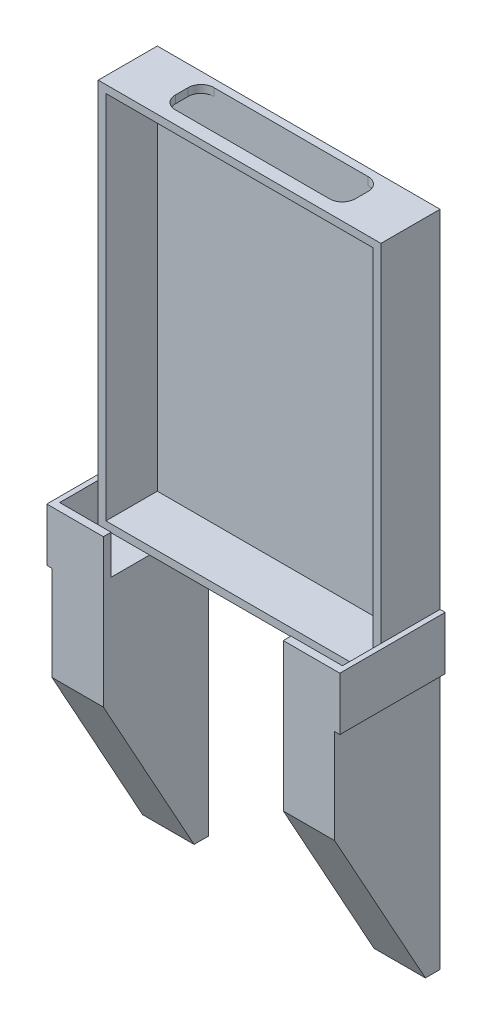
ISO-10303-21;
HEADER;
FILE_DESCRIPTION(('STEP AP214'),'2;1');
FILE_NAME('part.step','',(''),(''),'','','');
FILE_SCHEMA(('AUTOMOTIVE_DESIGN { 1 0 10303 214 1 1 1 1 }'));
ENDSEC;
DATA;
#1=APPLICATION_CONTEXT('core data for automotive mechanical design processes');
#2=APPLICATION_PROTOCOL_DEFINITION('international standard','automotive_design',2000,#1);
#3=PRODUCT_CONTEXT('',#1,'mechanical');
#4=PRODUCT('Part','Part','',(#3));
#5=PRODUCT_RELATED_PRODUCT_CATEGORY('part','',(#4));
#6=PRODUCT_DEFINITION_FORMATION('','',#4);
#7=PRODUCT_DEFINITION_CONTEXT('part definition',#1,'design');
#8=PRODUCT_DEFINITION('design','',#6,#7);
#9=PRODUCT_DEFINITION_SHAPE('','',#8);
#10=(LENGTH_UNIT() NAMED_UNIT(*) SI_UNIT(.MILLI.,.METRE.));
#11=(NAMED_UNIT(*) PLANE_ANGLE_UNIT() SI_UNIT($,.RADIAN.));
#12=(NAMED_UNIT(*) SI_UNIT($,.STERADIAN.) SOLID_ANGLE_UNIT());
#13=UNCERTAINTY_MEASURE_WITH_UNIT(LENGTH_MEASURE(1.E-05),#10,'distance_accuracy_value','');
#14=(GEOMETRIC_REPRESENTATION_CONTEXT(3) GLOBAL_UNCERTAINTY_ASSIGNED_CONTEXT((#13)) GLOBAL_UNIT_ASSIGNED_CONTEXT((#10,
#11,#12)) REPRESENTATION_CONTEXT('',''));
#15=CARTESIAN_POINT('',(0.,0.,0.));
#16=DIRECTION('',(0.,0.,1.));
#17=DIRECTION('',(1.,0.,0.));
#18=AXIS2_PLACEMENT_3D('',#15,#16,#17);
#19=CARTESIAN_POINT('',(-55.,-75.,3.));
#20=DIRECTION('',(0.,1.,0.));
#21=DIRECTION('',(0.,0.,1.));
#22=AXIS2_PLACEMENT_3D('',#19,#20,#21);
#23=PLANE('',#22);
#24=DIRECTION('',(0.,0.,-1.));
#25=VECTOR('',#24,1.);
#26=CARTESIAN_POINT('',(35.,-75.,0.));
#27=LINE('',#26,#25);
#28=CARTESIAN_POINT('',(35.,-75.,23.));
#29=VERTEX_POINT('',#28);
#30=CARTESIAN_POINT('',(35.,-75.,0.));
#31=VERTEX_POINT('',#30);
#32=EDGE_CURVE('E60',#29,#31,#27,.T.);
#33=ORIENTED_EDGE('',*,*,#32,.F.);
#34=DIRECTION('',(1.,0.,0.));
#35=VECTOR('',#34,1.);
#36=CARTESIAN_POINT('',(-55.,-75.,23.));
#37=LINE('',#36,#35);
#38=CARTESIAN_POINT('',(-35.,-75.,23.));
#39=VERTEX_POINT('',#38);
#40=EDGE_CURVE('E453',#39,#29,#37,.T.);
#41=ORIENTED_EDGE('',*,*,#40,.F.);
#42=DIRECTION('',(0.,0.,-1.));
#43=VECTOR('',#42,1.);
#44=CARTESIAN_POINT('',(-35.,-75.,0.));
#45=LINE('',#44,#43);
#46=CARTESIAN_POINT('',(-35.,-75.,0.));
#47=VERTEX_POINT('',#46);
#48=EDGE_CURVE('E378',#39,#47,#45,.T.);
#49=ORIENTED_EDGE('',*,*,#48,.T.);
#50=DIRECTION('',(1.,0.,0.));
#51=VECTOR('',#50,1.);
#52=CARTESIAN_POINT('',(-55.,-75.,0.));
#53=LINE('',#52,#51);
#54=EDGE_CURVE('E56',#47,#31,#53,.T.);
#55=ORIENTED_EDGE('',*,*,#54,.T.);
#56=EDGE_LOOP('',(#33,#41,#49,#55));
#57=FACE_BOUND('',#56,.T.);
#58=ADVANCED_FACE('F39',(#57),#23,.F.);
#59=CARTESIAN_POINT('',(55.,0.,0.));
#60=DIRECTION('',(-1.,0.,0.));
#61=DIRECTION('',(0.,0.,-1.));
#62=AXIS2_PLACEMENT_3D('',#59,#60,#61);
#63=PLANE('',#62);
#64=DIRECTION('',(0.,0.,-1.));
#65=VECTOR('',#64,1.);
#66=CARTESIAN_POINT('',(55.,-75.,23.));
#67=LINE('',#66,#65);
#68=CARTESIAN_POINT('',(55.,-75.,38.));
#69=VERTEX_POINT('',#68);
#70=CARTESIAN_POINT('',(55.,-75.,23.));
#71=VERTEX_POINT('',#70);
#72=EDGE_CURVE('E1122',#69,#71,#67,.T.);
#73=ORIENTED_EDGE('',*,*,#72,.F.);
#74=DIRECTION('',(0.,-1.,0.));
#75=VECTOR('',#74,1.);
#76=CARTESIAN_POINT('',(55.,-75.,38.));
#77=LINE('',#76,#75);
#78=CARTESIAN_POINT('',(55.,-59.8162092115961,38.));
#79=VERTEX_POINT('',#78);
#80=EDGE_CURVE('E296',#79,#69,#77,.T.);
#81=ORIENTED_EDGE('',*,*,#80,.F.);
#82=DIRECTION('',(0.,0.,-1.));
#83=VECTOR('',#82,1.);
#84=CARTESIAN_POINT('',(55.,-59.8162092115961,41.));
#85=LINE('',#84,#83);
#86=CARTESIAN_POINT('',(55.,-59.8162092115961,23.));
#87=VERTEX_POINT('',#86);
#88=EDGE_CURVE('E49',#79,#87,#85,.T.);
#89=ORIENTED_EDGE('',*,*,#88,.T.);
#90=DIRECTION('',(0.,1.,0.));
#91=VECTOR('',#90,1.);
#92=CARTESIAN_POINT('',(55.,-75.,23.));
#93=LINE('',#92,#91);
#94=EDGE_CURVE('E458',#71,#87,#93,.T.);
#95=ORIENTED_EDGE('',*,*,#94,.F.);
#96=EDGE_LOOP('',(#73,#81,#89,#95));
#97=FACE_BOUND('',#96,.T.);
#98=ADVANCED_FACE('F572',(#97),#63,.T.);
#99=CARTESIAN_POINT('',(-55.,-75.,3.));
#100=DIRECTION('',(1.,0.,0.));
#101=DIRECTION('',(0.,0.,-1.));
#102=AXIS2_PLACEMENT_3D('',#99,#100,#101);
#103=PLANE('',#102);
#104=DIRECTION('',(0.,0.,1.));
#105=VECTOR('',#104,1.);
#106=CARTESIAN_POINT('',(-55.,-80.5021010947171,41.));
#107=LINE('',#106,#105);
#108=CARTESIAN_POINT('',(-55.,-80.5021010947171,0.));
#109=VERTEX_POINT('',#108);
#110=CARTESIAN_POINT('',(-55.,-80.5021010947171,41.));
#111=VERTEX_POINT('',#110);
#112=EDGE_CURVE('E354',#109,#111,#107,.T.);
#113=ORIENTED_EDGE('',*,*,#112,.F.);
#114=DIRECTION('',(0.,-1.,0.));
#115=VECTOR('',#114,1.);
#116=CARTESIAN_POINT('',(-55.,-75.,0.));
#117=LINE('',#116,#115);
#118=CARTESIAN_POINT('',(-55.,-181.163787755552,0.));
#119=VERTEX_POINT('',#118);
#120=EDGE_CURVE('E473',#109,#119,#117,.T.);
#121=ORIENTED_EDGE('',*,*,#120,.T.);
#122=DIRECTION('',(0.,0.,1.));
#123=VECTOR('',#122,1.);
#124=CARTESIAN_POINT('',(-55.,-181.163787755552,5.7001744563118));
#125=LINE('',#124,#123);
#126=CARTESIAN_POINT('',(-55.,-181.163787755552,5.7001744563118));
#127=VERTEX_POINT('',#126);
#128=EDGE_CURVE('E374',#119,#127,#125,.T.);
#129=ORIENTED_EDGE('',*,*,#128,.T.);
#130=DIRECTION('',(0.,0.875411091895848,0.483379168133794));
#131=VECTOR('',#130,1.);
#132=CARTESIAN_POINT('',(-55.,-117.234969841786,41.));
#133=LINE('',#132,#131);
#134=CARTESIAN_POINT('',(-55.,-117.234969841786,41.));
#135=VERTEX_POINT('',#134);
#136=EDGE_CURVE('E399',#127,#135,#133,.T.);
#137=ORIENTED_EDGE('',*,*,#136,.T.);
#138=DIRECTION('',(0.,1.,0.));
#139=VECTOR('',#138,1.);
#140=CARTESIAN_POINT('',(-55.,-59.8162092115961,41.));
#141=LINE('',#140,#139);
#142=EDGE_CURVE('E402',#135,#111,#141,.T.);
#143=ORIENTED_EDGE('',*,*,#142,.T.);
#144=EDGE_LOOP('',(#113,#121,#129,#137,#143));
#145=FACE_BOUND('',#144,.T.);
#146=ADVANCED_FACE('F579',(#145),#103,.F.);
#147=CARTESIAN_POINT('',(-55.,75.,0.));
#148=VERTEX_POINT('',#147);
#149=CARTESIAN_POINT('',(-55.,-59.8162092115961,0.));
#150=VERTEX_POINT('',#149);
#151=EDGE_CURVE('E474',#148,#150,#117,.T.);
#152=ORIENTED_EDGE('',*,*,#151,.T.);
#153=DIRECTION('',(0.,0.,-1.));
#154=VECTOR('',#153,1.);
#155=CARTESIAN_POINT('',(-55.,-59.8162092115961,41.));
#156=LINE('',#155,#154);
#157=CARTESIAN_POINT('',(-55.,-59.8162092115961,23.));
#158=VERTEX_POINT('',#157);
#159=EDGE_CURVE('E363',#158,#150,#156,.T.);
#160=ORIENTED_EDGE('',*,*,#159,.F.);
#161=DIRECTION('',(0.,-1.,0.));
#162=VECTOR('',#161,1.);
#163=CARTESIAN_POINT('',(-55.,75.,23.));
#164=LINE('',#163,#162);
#165=CARTESIAN_POINT('',(-55.,75.,23.));
#166=VERTEX_POINT('',#165);
#167=EDGE_CURVE('E465',#166,#158,#164,.T.);
#168=ORIENTED_EDGE('',*,*,#167,.F.);
#169=DIRECTION('',(0.,0.,-1.));
#170=VECTOR('',#169,1.);
#171=CARTESIAN_POINT('',(-55.,75.,3.));
#172=LINE('',#171,#170);
#173=EDGE_CURVE('E478',#166,#148,#172,.T.);
#174=ORIENTED_EDGE('',*,*,#173,.T.);
#175=EDGE_LOOP('',(#152,#160,#168,#174));
#176=FACE_BOUND('',#175,.T.);
#177=ADVANCED_FACE('F588',(#176),#103,.F.);
#178=CARTESIAN_POINT('',(55.,-75.,3.));
#179=DIRECTION('',(-1.,0.,0.));
#180=DIRECTION('',(0.,0.,1.));
#181=AXIS2_PLACEMENT_3D('',#178,#179,#180);
#182=PLANE('',#181);
#183=CARTESIAN_POINT('',(55.,75.,23.));
#184=VERTEX_POINT('',#183);
#185=EDGE_CURVE('E457',#87,#184,#93,.T.);
#186=ORIENTED_EDGE('',*,*,#185,.F.);
#187=CARTESIAN_POINT('',(55.,-59.8162092115961,0.));
#188=VERTEX_POINT('',#187);
#189=EDGE_CURVE('E11',#87,#188,#85,.T.);
#190=ORIENTED_EDGE('',*,*,#189,.T.);
#191=DIRECTION('',(0.,1.,0.));
#192=VECTOR('',#191,1.);
#193=CARTESIAN_POINT('',(55.,-75.,0.));
#194=LINE('',#193,#192);
#195=CARTESIAN_POINT('',(55.,75.,0.));
#196=VERTEX_POINT('',#195);
#197=EDGE_CURVE('E468',#188,#196,#194,.T.);
#198=ORIENTED_EDGE('',*,*,#197,.T.);
#199=DIRECTION('',(0.,0.,-1.));
#200=VECTOR('',#199,1.);
#201=CARTESIAN_POINT('',(55.,75.,3.));
#202=LINE('',#201,#200);
#203=EDGE_CURVE('E480',#184,#196,#202,.T.);
#204=ORIENTED_EDGE('',*,*,#203,.F.);
#205=EDGE_LOOP('',(#186,#190,#198,#204));
#206=FACE_BOUND('',#205,.T.);
#207=ADVANCED_FACE('F592',(#206),#182,.F.);
#208=CARTESIAN_POINT('',(-55.,75.,3.));
#209=DIRECTION('',(0.,-1.,0.));
#210=DIRECTION('',(0.,0.,-1.));
#211=AXIS2_PLACEMENT_3D('',#208,#209,#210);
#212=PLANE('',#211);
#213=CARTESIAN_POINT('',(-30.,75.,8.));
#214=DIRECTION('',(0.,-1.,0.));
#215=DIRECTION('',(0.,0.,-1.));
#216=AXIS2_PLACEMENT_3D('',#213,#214,#215);
#217=CIRCLE('',#216,5.);
#218=CARTESIAN_POINT('',(-35.,75.,8.));
#219=VERTEX_POINT('',#218);
#220=CARTESIAN_POINT('',(-30.,75.,3.));
#221=VERTEX_POINT('',#220);
#222=EDGE_CURVE('E511',#219,#221,#217,.T.);
#223=ORIENTED_EDGE('',*,*,#222,.T.);
#224=DIRECTION('',(-1.,0.,0.));
#225=VECTOR('',#224,1.);
#226=CARTESIAN_POINT('',(-35.,75.,3.));
#227=LINE('',#226,#225);
#228=CARTESIAN_POINT('',(30.,75.,3.));
#229=VERTEX_POINT('',#228);
#230=EDGE_CURVE('E340',#229,#221,#227,.T.);
#231=ORIENTED_EDGE('',*,*,#230,.F.);
#232=CARTESIAN_POINT('',(30.,75.,8.));
#233=DIRECTION('',(0.,-1.,0.));
#234=DIRECTION('',(0.,0.,-1.));
#235=AXIS2_PLACEMENT_3D('',#232,#233,#234);
#236=CIRCLE('',#235,5.);
#237=CARTESIAN_POINT('',(35.,75.,8.));
#238=VERTEX_POINT('',#237);
#239=EDGE_CURVE('E518',#229,#238,#236,.T.);
#240=ORIENTED_EDGE('',*,*,#239,.T.);
#241=DIRECTION('',(0.,0.,-1.));
#242=VECTOR('',#241,1.);
#243=CARTESIAN_POINT('',(35.,75.,3.));
#244=LINE('',#243,#242);
#245=CARTESIAN_POINT('',(35.,75.,13.));
#246=VERTEX_POINT('',#245);
#247=EDGE_CURVE('E337',#246,#238,#244,.T.);
#248=ORIENTED_EDGE('',*,*,#247,.F.);
#249=CARTESIAN_POINT('',(30.,75.,13.));
#250=DIRECTION('',(0.,-1.,0.));
#251=DIRECTION('',(0.,0.,-1.));
#252=AXIS2_PLACEMENT_3D('',#249,#250,#251);
#253=CIRCLE('',#252,5.);
#254=CARTESIAN_POINT('',(30.,75.,18.));
#255=VERTEX_POINT('',#254);
#256=EDGE_CURVE('E515',#246,#255,#253,.T.);
#257=ORIENTED_EDGE('',*,*,#256,.T.);
#258=DIRECTION('',(1.,0.,0.));
#259=VECTOR('',#258,1.);
#260=CARTESIAN_POINT('',(-35.,75.,18.));
#261=LINE('',#260,#259);
#262=CARTESIAN_POINT('',(-30.,75.,18.));
#263=VERTEX_POINT('',#262);
#264=EDGE_CURVE('E334',#263,#255,#261,.T.);
#265=ORIENTED_EDGE('',*,*,#264,.F.);
#266=CARTESIAN_POINT('',(-30.,75.,13.));
#267=DIRECTION('',(0.,-1.,0.));
#268=DIRECTION('',(0.,0.,-1.));
#269=AXIS2_PLACEMENT_3D('',#266,#267,#268);
#270=CIRCLE('',#269,5.);
#271=CARTESIAN_POINT('',(-35.,75.,13.));
#272=VERTEX_POINT('',#271);
#273=EDGE_CURVE('E507',#263,#272,#270,.T.);
#274=ORIENTED_EDGE('',*,*,#273,.T.);
#275=DIRECTION('',(0.,0.,1.));
#276=VECTOR('',#275,1.);
#277=CARTESIAN_POINT('',(-35.,75.,3.));
#278=LINE('',#277,#276);
#279=EDGE_CURVE('E331',#219,#272,#278,.T.);
#280=ORIENTED_EDGE('',*,*,#279,.F.);
#281=EDGE_LOOP('',(#223,#231,#240,#248,#257,#265,#274,#280));
#282=FACE_BOUND('',#281,.T.);
#283=DIRECTION('',(-1.,0.,0.));
#284=VECTOR('',#283,1.);
#285=CARTESIAN_POINT('',(-55.,75.,0.));
#286=LINE('',#285,#284);
#287=EDGE_CURVE('E470',#196,#148,#286,.T.);
#288=ORIENTED_EDGE('',*,*,#287,.T.);
#289=ORIENTED_EDGE('',*,*,#173,.F.);
#290=DIRECTION('',(-1.,0.,0.));
#291=VECTOR('',#290,1.);
#292=CARTESIAN_POINT('',(55.,75.,23.));
#293=LINE('',#292,#291);
#294=EDGE_CURVE('E461',#184,#166,#293,.T.);
#295=ORIENTED_EDGE('',*,*,#294,.F.);
#296=ORIENTED_EDGE('',*,*,#203,.T.);
#297=EDGE_LOOP('',(#288,#289,#295,#296));
#298=FACE_BOUND('',#297,.T.);
#299=ADVANCED_FACE('F536',(#282,#298),#212,.F.);
#300=CARTESIAN_POINT('',(0.,0.,0.));
#301=DIRECTION('',(0.,0.,-1.));
#302=DIRECTION('',(-1.,0.,0.));
#303=AXIS2_PLACEMENT_3D('',#300,#301,#302);
#304=PLANE('',#303);
#305=DIRECTION('',(1.,0.,0.));
#306=VECTOR('',#305,1.);
#307=CARTESIAN_POINT('',(-57.,-59.8162092115961,0.));
#308=LINE('',#307,#306);
#309=CARTESIAN_POINT('',(-57.,-59.8162092115961,0.));
#310=VERTEX_POINT('',#309);
#311=EDGE_CURVE('E371',#310,#150,#308,.T.);
#312=ORIENTED_EDGE('',*,*,#311,.T.);
#313=ORIENTED_EDGE('',*,*,#151,.F.);
#314=ORIENTED_EDGE('',*,*,#287,.F.);
#315=ORIENTED_EDGE('',*,*,#197,.F.);
#316=DIRECTION('',(-1.,0.,0.));
#317=VECTOR('',#316,1.);
#318=CARTESIAN_POINT('',(57.,-59.8162092115961,0.));
#319=LINE('',#318,#317);
#320=CARTESIAN_POINT('',(57.,-59.8162092115961,0.));
#321=VERTEX_POINT('',#320);
#322=EDGE_CURVE('E325',#321,#188,#319,.T.);
#323=ORIENTED_EDGE('',*,*,#322,.F.);
#324=DIRECTION('',(0.,-1.,0.));
#325=VECTOR('',#324,1.);
#326=CARTESIAN_POINT('',(57.,-59.8162092115961,0.));
#327=LINE('',#326,#325);
#328=CARTESIAN_POINT('',(57.,-80.5021010947171,0.));
#329=VERTEX_POINT('',#328);
#330=EDGE_CURVE('E315',#321,#329,#327,.T.);
#331=ORIENTED_EDGE('',*,*,#330,.T.);
#332=DIRECTION('',(-1.,0.,0.));
#333=VECTOR('',#332,1.);
#334=CARTESIAN_POINT('',(57.,-80.5021010947171,0.));
#335=LINE('',#334,#333);
#336=CARTESIAN_POINT('',(55.,-80.5021010947171,0.));
#337=VERTEX_POINT('',#336);
#338=EDGE_CURVE('E327',#329,#337,#335,.T.);
#339=ORIENTED_EDGE('',*,*,#338,.T.);
#340=DIRECTION('',(0.,-1.,0.));
#341=VECTOR('',#340,1.);
#342=CARTESIAN_POINT('',(55.,-181.163787755552,0.));
#343=LINE('',#342,#341);
#344=CARTESIAN_POINT('',(55.,-181.163787755552,0.));
#345=VERTEX_POINT('',#344);
#346=EDGE_CURVE('E1098',#337,#345,#343,.T.);
#347=ORIENTED_EDGE('',*,*,#346,.T.);
#348=DIRECTION('',(1.,0.,0.));
#349=VECTOR('',#348,1.);
#350=CARTESIAN_POINT('',(35.,-181.163787755552,0.));
#351=LINE('',#350,#349);
#352=CARTESIAN_POINT('',(35.,-181.163787755552,0.));
#353=VERTEX_POINT('',#352);
#354=EDGE_CURVE('E308',#353,#345,#351,.T.);
#355=ORIENTED_EDGE('',*,*,#354,.F.);
#356=DIRECTION('',(0.,-1.,0.));
#357=VECTOR('',#356,1.);
#358=CARTESIAN_POINT('',(35.,-181.163787755552,0.));
#359=LINE('',#358,#357);
#360=EDGE_CURVE('E298',#31,#353,#359,.T.);
#361=ORIENTED_EDGE('',*,*,#360,.F.);
#362=ORIENTED_EDGE('',*,*,#54,.F.);
#363=DIRECTION('',(0.,-1.,0.));
#364=VECTOR('',#363,1.);
#365=CARTESIAN_POINT('',(-35.,-181.163787755552,0.));
#366=LINE('',#365,#364);
#367=CARTESIAN_POINT('',(-35.,-181.163787755552,0.));
#368=VERTEX_POINT('',#367);
#369=EDGE_CURVE('E377',#47,#368,#366,.T.);
#370=ORIENTED_EDGE('',*,*,#369,.T.);
#371=DIRECTION('',(-1.,0.,0.));
#372=VECTOR('',#371,1.);
#373=CARTESIAN_POINT('',(-35.,-181.163787755552,0.));
#374=LINE('',#373,#372);
#375=EDGE_CURVE('E396',#368,#119,#374,.T.);
#376=ORIENTED_EDGE('',*,*,#375,.T.);
#377=ORIENTED_EDGE('',*,*,#120,.F.);
#378=DIRECTION('',(1.,0.,0.));
#379=VECTOR('',#378,1.);
#380=CARTESIAN_POINT('',(-57.,-80.5021010947171,0.));
#381=LINE('',#380,#379);
#382=CARTESIAN_POINT('',(-57.,-80.5021010947171,0.));
#383=VERTEX_POINT('',#382);
#384=EDGE_CURVE('E368',#383,#109,#381,.T.);
#385=ORIENTED_EDGE('',*,*,#384,.F.);
#386=DIRECTION('',(0.,-1.,0.));
#387=VECTOR('',#386,1.);
#388=CARTESIAN_POINT('',(-57.,-59.8162092115961,0.));
#389=LINE('',#388,#387);
#390=EDGE_CURVE('E356',#310,#383,#389,.T.);
#391=ORIENTED_EDGE('',*,*,#390,.F.);
#392=EDGE_LOOP('',(#312,#313,#314,#315,#323,#331,#339,#347,#355,#361,#362,#370,#376,#377,#385,#391));
#393=FACE_BOUND('',#392,.T.);
#394=ADVANCED_FACE('F584',(#393),#304,.T.);
#395=CARTESIAN_POINT('',(0.,0.,23.));
#396=DIRECTION('',(0.,0.,1.));
#397=DIRECTION('',(1.,0.,0.));
#398=AXIS2_PLACEMENT_3D('',#395,#396,#397);
#399=PLANE('',#398);
#400=CARTESIAN_POINT('',(-55.,-75.,23.));
#401=VERTEX_POINT('',#400);
#402=EDGE_CURVE('E454',#401,#39,#37,.T.);
#403=ORIENTED_EDGE('',*,*,#402,.T.);
#404=ORIENTED_EDGE('',*,*,#40,.T.);
#405=DIRECTION('',(1.,0.,0.));
#406=VECTOR('',#405,1.);
#407=CARTESIAN_POINT('',(0.,-75.,23.));
#408=LINE('',#407,#406);
#409=EDGE_CURVE('E280',#29,#71,#408,.T.);
#410=ORIENTED_EDGE('',*,*,#409,.T.);
#411=ORIENTED_EDGE('',*,*,#94,.T.);
#412=ORIENTED_EDGE('',*,*,#185,.T.);
#413=ORIENTED_EDGE('',*,*,#294,.T.);
#414=ORIENTED_EDGE('',*,*,#167,.T.);
#415=EDGE_CURVE('E464',#158,#401,#164,.T.);
#416=ORIENTED_EDGE('',*,*,#415,.T.);
#417=EDGE_LOOP('',(#403,#404,#410,#411,#412,#413,#414,#416));
#418=FACE_BOUND('',#417,.T.);
#419=DIRECTION('',(0.,1.,0.));
#420=VECTOR('',#419,1.);
#421=CARTESIAN_POINT('',(52.,-72.,23.));
#422=LINE('',#421,#420);
#423=CARTESIAN_POINT('',(52.,-72.,23.));
#424=VERTEX_POINT('',#423);
#425=CARTESIAN_POINT('',(52.,72.,23.));
#426=VERTEX_POINT('',#425);
#427=EDGE_CURVE('E425',#424,#426,#422,.T.);
#428=ORIENTED_EDGE('',*,*,#427,.F.);
#429=DIRECTION('',(1.,0.,0.));
#430=VECTOR('',#429,1.);
#431=CARTESIAN_POINT('',(-52.,-72.,23.));
#432=LINE('',#431,#430);
#433=CARTESIAN_POINT('',(-52.,-72.,23.));
#434=VERTEX_POINT('',#433);
#435=EDGE_CURVE('E423',#434,#424,#432,.T.);
#436=ORIENTED_EDGE('',*,*,#435,.F.);
#437=DIRECTION('',(0.,-1.,0.));
#438=VECTOR('',#437,1.);
#439=CARTESIAN_POINT('',(-52.,72.,23.));
#440=LINE('',#439,#438);
#441=CARTESIAN_POINT('',(-52.,72.,23.));
#442=VERTEX_POINT('',#441);
#443=EDGE_CURVE('E431',#442,#434,#440,.T.);
#444=ORIENTED_EDGE('',*,*,#443,.F.);
#445=DIRECTION('',(-1.,0.,0.));
#446=VECTOR('',#445,1.);
#447=CARTESIAN_POINT('',(52.,72.,23.));
#448=LINE('',#447,#446);
#449=EDGE_CURVE('E428',#426,#442,#448,.T.);
#450=ORIENTED_EDGE('',*,*,#449,.F.);
#451=EDGE_LOOP('',(#428,#436,#444,#450));
#452=FACE_BOUND('',#451,.T.);
#453=ADVANCED_FACE('F708',(#418,#452),#399,.T.);
#454=CARTESIAN_POINT('',(-52.,-72.,23.));
#455=DIRECTION('',(0.,1.,0.));
#456=DIRECTION('',(0.,0.,1.));
#457=AXIS2_PLACEMENT_3D('',#454,#455,#456);
#458=PLANE('',#457);
#459=DIRECTION('',(1.,0.,0.));
#460=VECTOR('',#459,1.);
#461=CARTESIAN_POINT('',(-52.,-72.,3.));
#462=LINE('',#461,#460);
#463=CARTESIAN_POINT('',(-52.,-72.,3.));
#464=VERTEX_POINT('',#463);
#465=CARTESIAN_POINT('',(52.,-72.,3.));
#466=VERTEX_POINT('',#465);
#467=EDGE_CURVE('E412',#464,#466,#462,.T.);
#468=ORIENTED_EDGE('',*,*,#467,.F.);
#469=DIRECTION('',(0.,0.,-1.));
#470=VECTOR('',#469,1.);
#471=CARTESIAN_POINT('',(-52.,-72.,23.));
#472=LINE('',#471,#470);
#473=EDGE_CURVE('E433',#434,#464,#472,.T.);
#474=ORIENTED_EDGE('',*,*,#473,.F.);
#475=ORIENTED_EDGE('',*,*,#435,.T.);
#476=DIRECTION('',(0.,0.,-1.));
#477=VECTOR('',#476,1.);
#478=CARTESIAN_POINT('',(52.,-72.,23.));
#479=LINE('',#478,#477);
#480=EDGE_CURVE('E450',#424,#466,#479,.T.);
#481=ORIENTED_EDGE('',*,*,#480,.T.);
#482=EDGE_LOOP('',(#468,#474,#475,#481));
#483=FACE_BOUND('',#482,.T.);
#484=ADVANCED_FACE('F712',(#483),#458,.T.);
#485=CARTESIAN_POINT('',(52.,-72.,23.));
#486=DIRECTION('',(-1.,0.,0.));
#487=DIRECTION('',(0.,0.,1.));
#488=AXIS2_PLACEMENT_3D('',#485,#486,#487);
#489=PLANE('',#488);
#490=DIRECTION('',(0.,1.,0.));
#491=VECTOR('',#490,1.);
#492=CARTESIAN_POINT('',(52.,-72.,3.));
#493=LINE('',#492,#491);
#494=CARTESIAN_POINT('',(52.,72.,3.));
#495=VERTEX_POINT('',#494);
#496=EDGE_CURVE('E436',#466,#495,#493,.T.);
#497=ORIENTED_EDGE('',*,*,#496,.F.);
#498=ORIENTED_EDGE('',*,*,#480,.F.);
#499=ORIENTED_EDGE('',*,*,#427,.T.);
#500=DIRECTION('',(0.,0.,-1.));
#501=VECTOR('',#500,1.);
#502=CARTESIAN_POINT('',(52.,72.,23.));
#503=LINE('',#502,#501);
#504=EDGE_CURVE('E448',#426,#495,#503,.T.);
#505=ORIENTED_EDGE('',*,*,#504,.T.);
#506=EDGE_LOOP('',(#497,#498,#499,#505));
#507=FACE_BOUND('',#506,.T.);
#508=ADVANCED_FACE('F982',(#507),#489,.T.);
#509=CARTESIAN_POINT('',(52.,72.,23.));
#510=DIRECTION('',(0.,-1.,0.));
#511=DIRECTION('',(0.,0.,-1.));
#512=AXIS2_PLACEMENT_3D('',#509,#510,#511);
#513=PLANE('',#512);
#514=DIRECTION('',(0.,0.,-1.));
#515=VECTOR('',#514,1.);
#516=CARTESIAN_POINT('',(-35.,72.,23.));
#517=LINE('',#516,#515);
#518=CARTESIAN_POINT('',(-35.,72.,13.));
#519=VERTEX_POINT('',#518);
#520=CARTESIAN_POINT('',(-35.,72.,8.));
#521=VERTEX_POINT('',#520);
#522=EDGE_CURVE('E346',#519,#521,#517,.T.);
#523=ORIENTED_EDGE('',*,*,#522,.F.);
#524=CARTESIAN_POINT('',(-30.,72.,13.));
#525=DIRECTION('',(0.,-1.,0.));
#526=DIRECTION('',(0.,0.,-1.));
#527=AXIS2_PLACEMENT_3D('',#524,#525,#526);
#528=CIRCLE('',#527,5.);
#529=CARTESIAN_POINT('',(-30.,72.,18.));
#530=VERTEX_POINT('',#529);
#531=EDGE_CURVE('E509',#519,#530,#528,.F.);
#532=ORIENTED_EDGE('',*,*,#531,.T.);
#533=DIRECTION('',(-1.,0.,0.));
#534=VECTOR('',#533,1.);
#535=CARTESIAN_POINT('',(52.,72.,18.));
#536=LINE('',#535,#534);
#537=CARTESIAN_POINT('',(30.,72.,18.));
#538=VERTEX_POINT('',#537);
#539=EDGE_CURVE('E483',#538,#530,#536,.T.);
#540=ORIENTED_EDGE('',*,*,#539,.F.);
#541=CARTESIAN_POINT('',(30.,72.,13.));
#542=DIRECTION('',(0.,-1.,0.));
#543=DIRECTION('',(0.,0.,-1.));
#544=AXIS2_PLACEMENT_3D('',#541,#542,#543);
#545=CIRCLE('',#544,5.);
#546=CARTESIAN_POINT('',(35.,72.,13.));
#547=VERTEX_POINT('',#546);
#548=EDGE_CURVE('E517',#538,#547,#545,.F.);
#549=ORIENTED_EDGE('',*,*,#548,.T.);
#550=DIRECTION('',(0.,0.,1.));
#551=VECTOR('',#550,1.);
#552=CARTESIAN_POINT('',(35.,72.,23.));
#553=LINE('',#552,#551);
#554=CARTESIAN_POINT('',(35.,72.,8.));
#555=VERTEX_POINT('',#554);
#556=EDGE_CURVE('E343',#555,#547,#553,.T.);
#557=ORIENTED_EDGE('',*,*,#556,.F.);
#558=CARTESIAN_POINT('',(30.,72.,8.));
#559=DIRECTION('',(0.,-1.,0.));
#560=DIRECTION('',(0.,0.,-1.));
#561=AXIS2_PLACEMENT_3D('',#558,#559,#560);
#562=CIRCLE('',#561,5.);
#563=CARTESIAN_POINT('',(30.,72.,3.));
#564=VERTEX_POINT('',#563);
#565=EDGE_CURVE('E43',#555,#564,#562,.F.);
#566=ORIENTED_EDGE('',*,*,#565,.T.);
#567=DIRECTION('',(-1.,0.,0.));
#568=VECTOR('',#567,1.);
#569=CARTESIAN_POINT('',(52.,72.,3.));
#570=LINE('',#569,#568);
#571=EDGE_CURVE('E440',#495,#564,#570,.T.);
#572=ORIENTED_EDGE('',*,*,#571,.F.);
#573=ORIENTED_EDGE('',*,*,#504,.F.);
#574=ORIENTED_EDGE('',*,*,#449,.T.);
#575=DIRECTION('',(0.,0.,-1.));
#576=VECTOR('',#575,1.);
#577=CARTESIAN_POINT('',(-52.,72.,23.));
#578=LINE('',#577,#576);
#579=CARTESIAN_POINT('',(-52.,72.,3.));
#580=VERTEX_POINT('',#579);
#581=EDGE_CURVE('E445',#442,#580,#578,.T.);
#582=ORIENTED_EDGE('',*,*,#581,.T.);
#583=CARTESIAN_POINT('',(-30.,72.,3.));
#584=VERTEX_POINT('',#583);
#585=EDGE_CURVE('E439',#584,#580,#570,.T.);
#586=ORIENTED_EDGE('',*,*,#585,.F.);
#587=CARTESIAN_POINT('',(-30.,72.,8.));
#588=DIRECTION('',(0.,-1.,0.));
#589=DIRECTION('',(0.,0.,-1.));
#590=AXIS2_PLACEMENT_3D('',#587,#588,#589);
#591=CIRCLE('',#590,5.);
#592=EDGE_CURVE('E513',#584,#521,#591,.F.);
#593=ORIENTED_EDGE('',*,*,#592,.T.);
#594=EDGE_LOOP('',(#523,#532,#540,#549,#557,#566,#572,#573,#574,#582,#586,#593));
#595=FACE_BOUND('',#594,.T.);
#596=ADVANCED_FACE('F529',(#595),#513,.T.);
#597=CARTESIAN_POINT('',(-52.,72.,23.));
#598=DIRECTION('',(1.,0.,0.));
#599=DIRECTION('',(0.,0.,-1.));
#600=AXIS2_PLACEMENT_3D('',#597,#598,#599);
#601=PLANE('',#600);
#602=DIRECTION('',(0.,-1.,0.));
#603=VECTOR('',#602,1.);
#604=CARTESIAN_POINT('',(-52.,72.,3.));
#605=LINE('',#604,#603);
#606=EDGE_CURVE('E426',#580,#464,#605,.T.);
#607=ORIENTED_EDGE('',*,*,#606,.F.);
#608=ORIENTED_EDGE('',*,*,#581,.F.);
#609=ORIENTED_EDGE('',*,*,#443,.T.);
#610=ORIENTED_EDGE('',*,*,#473,.T.);
#611=EDGE_LOOP('',(#607,#608,#609,#610));
#612=FACE_BOUND('',#611,.T.);
#613=ADVANCED_FACE('F909',(#612),#601,.T.);
#614=CARTESIAN_POINT('',(0.,0.,3.));
#615=DIRECTION('',(0.,0.,-1.));
#616=DIRECTION('',(-1.,0.,0.));
#617=AXIS2_PLACEMENT_3D('',#614,#615,#616);
#618=PLANE('',#617);
#619=ORIENTED_EDGE('',*,*,#230,.T.);
#620=DIRECTION('',(0.,1.,0.));
#621=VECTOR('',#620,1.);
#622=CARTESIAN_POINT('',(-30.,72.,3.));
#623=LINE('',#622,#621);
#624=EDGE_CURVE('E499',#221,#584,#623,.F.);
#625=ORIENTED_EDGE('',*,*,#624,.T.);
#626=ORIENTED_EDGE('',*,*,#585,.T.);
#627=ORIENTED_EDGE('',*,*,#606,.T.);
#628=ORIENTED_EDGE('',*,*,#467,.T.);
#629=ORIENTED_EDGE('',*,*,#496,.T.);
#630=ORIENTED_EDGE('',*,*,#571,.T.);
#631=DIRECTION('',(0.,1.,0.));
#632=VECTOR('',#631,1.);
#633=CARTESIAN_POINT('',(30.,75.,3.));
#634=LINE('',#633,#632);
#635=EDGE_CURVE('E496',#564,#229,#634,.T.);
#636=ORIENTED_EDGE('',*,*,#635,.T.);
#637=EDGE_LOOP('',(#619,#625,#626,#627,#628,#629,#630,#636));
#638=FACE_BOUND('',#637,.T.);
#639=ADVANCED_FACE('F534',(#638),#618,.F.);
#640=CARTESIAN_POINT('',(-35.,-75.,23.));
#641=DIRECTION('',(0.,1.,0.));
#642=DIRECTION('',(0.,0.,1.));
#643=AXIS2_PLACEMENT_3D('',#640,#641,#642);
#644=PLANE('',#643);
#645=CARTESIAN_POINT('',(-35.,-75.,38.));
#646=VERTEX_POINT('',#645);
#647=EDGE_CURVE('E375',#646,#39,#45,.T.);
#648=ORIENTED_EDGE('',*,*,#647,.T.);
#649=ORIENTED_EDGE('',*,*,#402,.F.);
#650=DIRECTION('',(0.,0.,-1.));
#651=VECTOR('',#650,1.);
#652=CARTESIAN_POINT('',(-55.,-75.,23.));
#653=LINE('',#652,#651);
#654=CARTESIAN_POINT('',(-55.,-75.,38.));
#655=VERTEX_POINT('',#654);
#656=EDGE_CURVE('E407',#655,#401,#653,.T.);
#657=ORIENTED_EDGE('',*,*,#656,.F.);
#658=DIRECTION('',(-1.,0.,0.));
#659=VECTOR('',#658,1.);
#660=CARTESIAN_POINT('',(-35.,-75.,38.));
#661=LINE('',#660,#659);
#662=EDGE_CURVE('E410',#646,#655,#661,.T.);
#663=ORIENTED_EDGE('',*,*,#662,.F.);
#664=EDGE_LOOP('',(#648,#649,#657,#663));
#665=FACE_BOUND('',#664,.T.);
#666=ADVANCED_FACE('F915',(#665),#644,.T.);
#667=CARTESIAN_POINT('',(-35.,-75.,38.));
#668=DIRECTION('',(0.,0.,-1.));
#669=DIRECTION('',(-1.,0.,0.));
#670=AXIS2_PLACEMENT_3D('',#667,#668,#669);
#671=PLANE('',#670);
#672=DIRECTION('',(0.,-1.,0.));
#673=VECTOR('',#672,1.);
#674=CARTESIAN_POINT('',(-55.,-75.,38.));
#675=LINE('',#674,#673);
#676=CARTESIAN_POINT('',(-55.,-59.8162092115961,38.));
#677=VERTEX_POINT('',#676);
#678=EDGE_CURVE('E404',#677,#655,#675,.T.);
#679=ORIENTED_EDGE('',*,*,#678,.F.);
#680=DIRECTION('',(-1.,0.,0.));
#681=VECTOR('',#680,1.);
#682=CARTESIAN_POINT('',(-35.,-59.8162092115961,38.));
#683=LINE('',#682,#681);
#684=CARTESIAN_POINT('',(-35.,-59.8162092115961,38.));
#685=VERTEX_POINT('',#684);
#686=EDGE_CURVE('E413',#685,#677,#683,.T.);
#687=ORIENTED_EDGE('',*,*,#686,.F.);
#688=DIRECTION('',(0.,-1.,0.));
#689=VECTOR('',#688,1.);
#690=CARTESIAN_POINT('',(-35.,-75.,38.));
#691=LINE('',#690,#689);
#692=EDGE_CURVE('E393',#685,#646,#691,.T.);
#693=ORIENTED_EDGE('',*,*,#692,.T.);
#694=ORIENTED_EDGE('',*,*,#662,.T.);
#695=EDGE_LOOP('',(#679,#687,#693,#694));
#696=FACE_BOUND('',#695,.T.);
#697=ADVANCED_FACE('F768',(#696),#671,.T.);
#698=CARTESIAN_POINT('',(-35.,-59.8162092115961,38.));
#699=DIRECTION('',(0.,1.,0.));
#700=DIRECTION('',(0.,0.,1.));
#701=AXIS2_PLACEMENT_3D('',#698,#699,#700);
#702=PLANE('',#701);
#703=ORIENTED_EDGE('',*,*,#686,.T.);
#704=EDGE_CURVE('E349',#677,#158,#156,.T.);
#705=ORIENTED_EDGE('',*,*,#704,.T.);
#706=ORIENTED_EDGE('',*,*,#159,.T.);
#707=ORIENTED_EDGE('',*,*,#311,.F.);
#708=DIRECTION('',(0.,0.,-1.));
#709=VECTOR('',#708,1.);
#710=CARTESIAN_POINT('',(-57.,-59.8162092115961,41.));
#711=LINE('',#710,#709);
#712=CARTESIAN_POINT('',(-57.,-59.8162092115961,41.));
#713=VERTEX_POINT('',#712);
#714=EDGE_CURVE('E353',#713,#310,#711,.T.);
#715=ORIENTED_EDGE('',*,*,#714,.F.);
#716=DIRECTION('',(-1.,0.,0.));
#717=VECTOR('',#716,1.);
#718=CARTESIAN_POINT('',(-35.,-59.8162092115961,41.));
#719=LINE('',#718,#717);
#720=CARTESIAN_POINT('',(-35.,-59.8162092115961,41.));
#721=VERTEX_POINT('',#720);
#722=EDGE_CURVE('E415',#721,#713,#719,.T.);
#723=ORIENTED_EDGE('',*,*,#722,.F.);
#724=DIRECTION('',(0.,0.,-1.));
#725=VECTOR('',#724,1.);
#726=CARTESIAN_POINT('',(-35.,-59.8162092115961,38.));
#727=LINE('',#726,#725);
#728=EDGE_CURVE('E390',#721,#685,#727,.T.);
#729=ORIENTED_EDGE('',*,*,#728,.T.);
#730=EDGE_LOOP('',(#703,#705,#706,#707,#715,#723,#729));
#731=FACE_BOUND('',#730,.T.);
#732=ADVANCED_FACE('F762',(#731),#702,.T.);
#733=CARTESIAN_POINT('',(-35.,-59.8162092115961,41.));
#734=DIRECTION('',(0.,0.,1.));
#735=DIRECTION('',(1.,0.,0.));
#736=AXIS2_PLACEMENT_3D('',#733,#734,#735);
#737=PLANE('',#736);
#738=ORIENTED_EDGE('',*,*,#142,.F.);
#739=DIRECTION('',(-1.,0.,0.));
#740=VECTOR('',#739,1.);
#741=CARTESIAN_POINT('',(-35.,-117.234969841786,41.));
#742=LINE('',#741,#740);
#743=CARTESIAN_POINT('',(-35.,-117.234969841786,41.));
#744=VERTEX_POINT('',#743);
#745=EDGE_CURVE('E417',#744,#135,#742,.T.);
#746=ORIENTED_EDGE('',*,*,#745,.F.);
#747=DIRECTION('',(0.,1.,0.));
#748=VECTOR('',#747,1.);
#749=CARTESIAN_POINT('',(-35.,-59.8162092115961,41.));
#750=LINE('',#749,#748);
#751=EDGE_CURVE('E387',#744,#721,#750,.T.);
#752=ORIENTED_EDGE('',*,*,#751,.T.);
#753=ORIENTED_EDGE('',*,*,#722,.T.);
#754=DIRECTION('',(0.,1.,0.));
#755=VECTOR('',#754,1.);
#756=CARTESIAN_POINT('',(-57.,-59.8162092115961,41.));
#757=LINE('',#756,#755);
#758=CARTESIAN_POINT('',(-57.,-80.5021010947171,41.));
#759=VERTEX_POINT('',#758);
#760=EDGE_CURVE('E350',#759,#713,#757,.T.);
#761=ORIENTED_EDGE('',*,*,#760,.F.);
#762=DIRECTION('',(1.,0.,0.));
#763=VECTOR('',#762,1.);
#764=CARTESIAN_POINT('',(-57.,-80.5021010947171,41.));
#765=LINE('',#764,#763);
#766=EDGE_CURVE('E360',#759,#111,#765,.T.);
#767=ORIENTED_EDGE('',*,*,#766,.T.);
#768=EDGE_LOOP('',(#738,#746,#752,#753,#761,#767));
#769=FACE_BOUND('',#768,.T.);
#770=ADVANCED_FACE('F767',(#769),#737,.T.);
#771=CARTESIAN_POINT('',(-35.,-117.234969841786,41.));
#772=DIRECTION('',(0.,-0.483379168133794,0.875411091895848));
#773=DIRECTION('',(0.,-0.875411091895849,-0.483379168133794));
#774=AXIS2_PLACEMENT_3D('',#771,#772,#773);
#775=PLANE('',#774);
#776=ORIENTED_EDGE('',*,*,#136,.F.);
#777=DIRECTION('',(-1.,0.,0.));
#778=VECTOR('',#777,1.);
#779=CARTESIAN_POINT('',(-35.,-181.163787755552,5.7001744563118));
#780=LINE('',#779,#778);
#781=CARTESIAN_POINT('',(-35.,-181.163787755552,5.7001744563118));
#782=VERTEX_POINT('',#781);
#783=EDGE_CURVE('E419',#782,#127,#780,.T.);
#784=ORIENTED_EDGE('',*,*,#783,.F.);
#785=DIRECTION('',(0.,0.875411091895848,0.483379168133794));
#786=VECTOR('',#785,1.);
#787=CARTESIAN_POINT('',(-35.,-117.234969841786,41.));
#788=LINE('',#787,#786);
#789=EDGE_CURVE('E384',#782,#744,#788,.T.);
#790=ORIENTED_EDGE('',*,*,#789,.T.);
#791=ORIENTED_EDGE('',*,*,#745,.T.);
#792=EDGE_LOOP('',(#776,#784,#790,#791));
#793=FACE_BOUND('',#792,.T.);
#794=ADVANCED_FACE('F946',(#793),#775,.T.);
#795=CARTESIAN_POINT('',(-35.,-181.163787755552,5.7001744563118));
#796=DIRECTION('',(0.,-1.,0.));
#797=DIRECTION('',(0.,0.,-1.));
#798=AXIS2_PLACEMENT_3D('',#795,#796,#797);
#799=PLANE('',#798);
#800=ORIENTED_EDGE('',*,*,#128,.F.);
#801=ORIENTED_EDGE('',*,*,#375,.F.);
#802=DIRECTION('',(0.,0.,1.));
#803=VECTOR('',#802,1.);
#804=CARTESIAN_POINT('',(-35.,-181.163787755552,5.7001744563118));
#805=LINE('',#804,#803);
#806=EDGE_CURVE('E381',#368,#782,#805,.T.);
#807=ORIENTED_EDGE('',*,*,#806,.T.);
#808=ORIENTED_EDGE('',*,*,#783,.T.);
#809=EDGE_LOOP('',(#800,#801,#807,#808));
#810=FACE_BOUND('',#809,.T.);
#811=ADVANCED_FACE('F784',(#810),#799,.T.);
#812=CARTESIAN_POINT('',(-35.,0.,0.));
#813=DIRECTION('',(-1.,0.,0.));
#814=DIRECTION('',(0.,0.,1.));
#815=AXIS2_PLACEMENT_3D('',#812,#813,#814);
#816=PLANE('',#815);
#817=ORIENTED_EDGE('',*,*,#647,.F.);
#818=ORIENTED_EDGE('',*,*,#692,.F.);
#819=ORIENTED_EDGE('',*,*,#728,.F.);
#820=ORIENTED_EDGE('',*,*,#751,.F.);
#821=ORIENTED_EDGE('',*,*,#789,.F.);
#822=ORIENTED_EDGE('',*,*,#806,.F.);
#823=ORIENTED_EDGE('',*,*,#369,.F.);
#824=ORIENTED_EDGE('',*,*,#48,.F.);
#825=EDGE_LOOP('',(#817,#818,#819,#820,#821,#822,#823,#824));
#826=FACE_BOUND('',#825,.T.);
#827=ADVANCED_FACE('F779',(#826),#816,.F.);
#828=CARTESIAN_POINT('',(-57.,-80.5021010947171,41.));
#829=DIRECTION('',(0.,1.,0.));
#830=DIRECTION('',(0.,0.,1.));
#831=AXIS2_PLACEMENT_3D('',#828,#829,#830);
#832=PLANE('',#831);
#833=ORIENTED_EDGE('',*,*,#112,.T.);
#834=ORIENTED_EDGE('',*,*,#766,.F.);
#835=DIRECTION('',(0.,0.,1.));
#836=VECTOR('',#835,1.);
#837=CARTESIAN_POINT('',(-57.,-80.5021010947171,41.));
#838=LINE('',#837,#836);
#839=EDGE_CURVE('E358',#383,#759,#838,.T.);
#840=ORIENTED_EDGE('',*,*,#839,.F.);
#841=ORIENTED_EDGE('',*,*,#384,.T.);
#842=EDGE_LOOP('',(#833,#834,#840,#841));
#843=FACE_BOUND('',#842,.T.);
#844=ADVANCED_FACE('F783',(#843),#832,.F.);
#845=CARTESIAN_POINT('',(-57.,0.,0.));
#846=DIRECTION('',(1.,0.,0.));
#847=DIRECTION('',(0.,0.,-1.));
#848=AXIS2_PLACEMENT_3D('',#845,#846,#847);
#849=PLANE('',#848);
#850=ORIENTED_EDGE('',*,*,#760,.T.);
#851=ORIENTED_EDGE('',*,*,#714,.T.);
#852=ORIENTED_EDGE('',*,*,#390,.T.);
#853=ORIENTED_EDGE('',*,*,#839,.T.);
#854=EDGE_LOOP('',(#850,#851,#852,#853));
#855=FACE_BOUND('',#854,.T.);
#856=ADVANCED_FACE('F865',(#855),#849,.F.);
#857=CARTESIAN_POINT('',(-55.,0.,0.));
#858=DIRECTION('',(1.,0.,0.));
#859=DIRECTION('',(0.,0.,-1.));
#860=AXIS2_PLACEMENT_3D('',#857,#858,#859);
#861=PLANE('',#860);
#862=ORIENTED_EDGE('',*,*,#704,.F.);
#863=ORIENTED_EDGE('',*,*,#678,.T.);
#864=ORIENTED_EDGE('',*,*,#656,.T.);
#865=ORIENTED_EDGE('',*,*,#415,.F.);
#866=EDGE_LOOP('',(#862,#863,#864,#865));
#867=FACE_BOUND('',#866,.T.);
#868=ADVANCED_FACE('F568',(#867),#861,.T.);
#869=CARTESIAN_POINT('',(-35.,67.,3.));
#870=DIRECTION('',(-1.,0.,0.));
#871=DIRECTION('',(0.,0.,1.));
#872=AXIS2_PLACEMENT_3D('',#869,#870,#871);
#873=PLANE('',#872);
#874=ORIENTED_EDGE('',*,*,#279,.T.);
#875=DIRECTION('',(0.,1.,0.));
#876=VECTOR('',#875,1.);
#877=CARTESIAN_POINT('',(-35.,72.,13.));
#878=LINE('',#877,#876);
#879=EDGE_CURVE('E494',#272,#519,#878,.F.);
#880=ORIENTED_EDGE('',*,*,#879,.T.);
#881=ORIENTED_EDGE('',*,*,#522,.T.);
#882=DIRECTION('',(0.,1.,0.));
#883=VECTOR('',#882,1.);
#884=CARTESIAN_POINT('',(-35.,75.,8.));
#885=LINE('',#884,#883);
#886=EDGE_CURVE('E491',#521,#219,#885,.T.);
#887=ORIENTED_EDGE('',*,*,#886,.T.);
#888=EDGE_LOOP('',(#874,#880,#881,#887));
#889=FACE_BOUND('',#888,.T.);
#890=ADVANCED_FACE('F544',(#889),#873,.F.);
#891=CARTESIAN_POINT('',(35.,67.,3.));
#892=DIRECTION('',(1.,0.,0.));
#893=DIRECTION('',(0.,0.,-1.));
#894=AXIS2_PLACEMENT_3D('',#891,#892,#893);
#895=PLANE('',#894);
#896=ORIENTED_EDGE('',*,*,#556,.T.);
#897=DIRECTION('',(0.,1.,0.));
#898=VECTOR('',#897,1.);
#899=CARTESIAN_POINT('',(35.,75.,13.));
#900=LINE('',#899,#898);
#901=EDGE_CURVE('E504',#547,#246,#900,.T.);
#902=ORIENTED_EDGE('',*,*,#901,.T.);
#903=ORIENTED_EDGE('',*,*,#247,.T.);
#904=DIRECTION('',(0.,1.,0.));
#905=VECTOR('',#904,1.);
#906=CARTESIAN_POINT('',(35.,72.,8.));
#907=LINE('',#906,#905);
#908=EDGE_CURVE('E502',#238,#555,#907,.F.);
#909=ORIENTED_EDGE('',*,*,#908,.T.);
#910=EDGE_LOOP('',(#896,#902,#903,#909));
#911=FACE_BOUND('',#910,.T.);
#912=ADVANCED_FACE('F560',(#911),#895,.F.);
#913=CARTESIAN_POINT('',(-35.,67.,18.));
#914=DIRECTION('',(0.,0.,1.));
#915=DIRECTION('',(1.,0.,0.));
#916=AXIS2_PLACEMENT_3D('',#913,#914,#915);
#917=PLANE('',#916);
#918=ORIENTED_EDGE('',*,*,#539,.T.);
#919=DIRECTION('',(0.,1.,0.));
#920=VECTOR('',#919,1.);
#921=CARTESIAN_POINT('',(-30.,75.,18.));
#922=LINE('',#921,#920);
#923=EDGE_CURVE('E488',#530,#263,#922,.T.);
#924=ORIENTED_EDGE('',*,*,#923,.T.);
#925=ORIENTED_EDGE('',*,*,#264,.T.);
#926=DIRECTION('',(0.,1.,0.));
#927=VECTOR('',#926,1.);
#928=CARTESIAN_POINT('',(30.,72.,18.));
#929=LINE('',#928,#927);
#930=EDGE_CURVE('E486',#255,#538,#929,.F.);
#931=ORIENTED_EDGE('',*,*,#930,.T.);
#932=EDGE_LOOP('',(#918,#924,#925,#931));
#933=FACE_BOUND('',#932,.T.);
#934=ADVANCED_FACE('F553',(#933),#917,.F.);
#935=CARTESIAN_POINT('',(-30.,67.,13.));
#936=DIRECTION('',(0.,-1.,0.));
#937=DIRECTION('',(0.,0.,-1.));
#938=AXIS2_PLACEMENT_3D('',#935,#936,#937);
#939=CYLINDRICAL_SURFACE('',#938,5.);
#940=ORIENTED_EDGE('',*,*,#531,.F.);
#941=ORIENTED_EDGE('',*,*,#879,.F.);
#942=ORIENTED_EDGE('',*,*,#273,.F.);
#943=ORIENTED_EDGE('',*,*,#923,.F.);
#944=EDGE_LOOP('',(#940,#941,#942,#943));
#945=FACE_BOUND('',#944,.T.);
#946=ADVANCED_FACE('F550',(#945),#939,.F.);
#947=CARTESIAN_POINT('',(-30.,67.,8.));
#948=DIRECTION('',(0.,-1.,0.));
#949=DIRECTION('',(0.,0.,-1.));
#950=AXIS2_PLACEMENT_3D('',#947,#948,#949);
#951=CYLINDRICAL_SURFACE('',#950,5.);
#952=ORIENTED_EDGE('',*,*,#592,.F.);
#953=ORIENTED_EDGE('',*,*,#624,.F.);
#954=ORIENTED_EDGE('',*,*,#222,.F.);
#955=ORIENTED_EDGE('',*,*,#886,.F.);
#956=EDGE_LOOP('',(#952,#953,#954,#955));
#957=FACE_BOUND('',#956,.T.);
#958=ADVANCED_FACE('F542',(#957),#951,.F.);
#959=CARTESIAN_POINT('',(30.,67.,13.));
#960=DIRECTION('',(0.,-1.,0.));
#961=DIRECTION('',(0.,0.,-1.));
#962=AXIS2_PLACEMENT_3D('',#959,#960,#961);
#963=CYLINDRICAL_SURFACE('',#962,5.);
#964=ORIENTED_EDGE('',*,*,#548,.F.);
#965=ORIENTED_EDGE('',*,*,#930,.F.);
#966=ORIENTED_EDGE('',*,*,#256,.F.);
#967=ORIENTED_EDGE('',*,*,#901,.F.);
#968=EDGE_LOOP('',(#964,#965,#966,#967));
#969=FACE_BOUND('',#968,.T.);
#970=ADVANCED_FACE('F558',(#969),#963,.F.);
#971=CARTESIAN_POINT('',(30.,0.,8.));
#972=DIRECTION('',(0.,-1.,0.));
#973=DIRECTION('',(0.,0.,-1.));
#974=AXIS2_PLACEMENT_3D('',#971,#972,#973);
#975=CYLINDRICAL_SURFACE('',#974,5.);
#976=ORIENTED_EDGE('',*,*,#565,.F.);
#977=ORIENTED_EDGE('',*,*,#908,.F.);
#978=ORIENTED_EDGE('',*,*,#239,.F.);
#979=ORIENTED_EDGE('',*,*,#635,.F.);
#980=EDGE_LOOP('',(#976,#977,#978,#979));
#981=FACE_BOUND('',#980,.T.);
#982=ADVANCED_FACE('F41',(#981),#975,.F.);
#983=CARTESIAN_POINT('',(57.,-59.8162092115961,41.));
#984=DIRECTION('',(0.,0.,1.));
#985=DIRECTION('',(1.,0.,0.));
#986=AXIS2_PLACEMENT_3D('',#983,#984,#985);
#987=PLANE('',#986);
#988=DIRECTION('',(-1.,0.,0.));
#989=VECTOR('',#988,1.);
#990=CARTESIAN_POINT('',(57.,-59.8162092115961,41.));
#991=LINE('',#990,#989);
#992=CARTESIAN_POINT('',(57.,-59.8162092115961,41.));
#993=VERTEX_POINT('',#992);
#994=CARTESIAN_POINT('',(35.,-59.8162092115961,41.));
#995=VERTEX_POINT('',#994);
#996=EDGE_CURVE('E321',#993,#995,#991,.T.);
#997=ORIENTED_EDGE('',*,*,#996,.T.);
#998=DIRECTION('',(0.,1.,0.));
#999=VECTOR('',#998,1.);
#1000=CARTESIAN_POINT('',(35.,-59.8162092115961,41.));
#1001=LINE('',#1000,#999);
#1002=CARTESIAN_POINT('',(35.,-117.234969841786,41.));
#1003=VERTEX_POINT('',#1002);
#1004=EDGE_CURVE('E1120',#1003,#995,#1001,.T.);
#1005=ORIENTED_EDGE('',*,*,#1004,.F.);
#1006=DIRECTION('',(1.,0.,0.));
#1007=VECTOR('',#1006,1.);
#1008=CARTESIAN_POINT('',(35.,-117.234969841786,41.));
#1009=LINE('',#1008,#1007);
#1010=CARTESIAN_POINT('',(55.,-117.234969841786,41.));
#1011=VERTEX_POINT('',#1010);
#1012=EDGE_CURVE('E300',#1003,#1011,#1009,.T.);
#1013=ORIENTED_EDGE('',*,*,#1012,.T.);
#1014=DIRECTION('',(0.,1.,0.));
#1015=VECTOR('',#1014,1.);
#1016=CARTESIAN_POINT('',(55.,-59.8162092115961,41.));
#1017=LINE('',#1016,#1015);
#1018=CARTESIAN_POINT('',(55.,-80.5021010947171,41.));
#1019=VERTEX_POINT('',#1018);
#1020=EDGE_CURVE('E1112',#1011,#1019,#1017,.T.);
#1021=ORIENTED_EDGE('',*,*,#1020,.T.);
#1022=DIRECTION('',(-1.,0.,0.));
#1023=VECTOR('',#1022,1.);
#1024=CARTESIAN_POINT('',(57.,-80.5021010947171,41.));
#1025=LINE('',#1024,#1023);
#1026=CARTESIAN_POINT('',(57.,-80.5021010947171,41.));
#1027=VERTEX_POINT('',#1026);
#1028=EDGE_CURVE('E329',#1027,#1019,#1025,.T.);
#1029=ORIENTED_EDGE('',*,*,#1028,.F.);
#1030=DIRECTION('',(0.,1.,0.));
#1031=VECTOR('',#1030,1.);
#1032=CARTESIAN_POINT('',(57.,-59.8162092115961,41.));
#1033=LINE('',#1032,#1031);
#1034=EDGE_CURVE('E309',#1027,#993,#1033,.T.);
#1035=ORIENTED_EDGE('',*,*,#1034,.T.);
#1036=EDGE_LOOP('',(#997,#1005,#1013,#1021,#1029,#1035));
#1037=FACE_BOUND('',#1036,.T.);
#1038=ADVANCED_FACE('F603',(#1037),#987,.T.);
#1039=CARTESIAN_POINT('',(57.,-80.5021010947171,41.));
#1040=DIRECTION('',(0.,-1.,0.));
#1041=DIRECTION('',(0.,0.,-1.));
#1042=AXIS2_PLACEMENT_3D('',#1039,#1040,#1041);
#1043=PLANE('',#1042);
#1044=DIRECTION('',(0.,0.,1.));
#1045=VECTOR('',#1044,1.);
#1046=CARTESIAN_POINT('',(55.,-80.5021010947171,41.));
#1047=LINE('',#1046,#1045);
#1048=EDGE_CURVE('E307',#337,#1019,#1047,.T.);
#1049=ORIENTED_EDGE('',*,*,#1048,.F.);
#1050=ORIENTED_EDGE('',*,*,#338,.F.);
#1051=DIRECTION('',(0.,0.,1.));
#1052=VECTOR('',#1051,1.);
#1053=CARTESIAN_POINT('',(57.,-80.5021010947171,41.));
#1054=LINE('',#1053,#1052);
#1055=EDGE_CURVE('E312',#329,#1027,#1054,.T.);
#1056=ORIENTED_EDGE('',*,*,#1055,.T.);
#1057=ORIENTED_EDGE('',*,*,#1028,.T.);
#1058=EDGE_LOOP('',(#1049,#1050,#1056,#1057));
#1059=FACE_BOUND('',#1058,.T.);
#1060=ADVANCED_FACE('F607',(#1059),#1043,.T.);
#1061=CARTESIAN_POINT('',(57.,-59.8162092115961,41.));
#1062=DIRECTION('',(0.,1.,0.));
#1063=DIRECTION('',(0.,0.,1.));
#1064=AXIS2_PLACEMENT_3D('',#1061,#1062,#1063);
#1065=PLANE('',#1064);
#1066=ORIENTED_EDGE('',*,*,#88,.F.);
#1067=DIRECTION('',(1.,0.,0.));
#1068=VECTOR('',#1067,1.);
#1069=CARTESIAN_POINT('',(35.,-59.8162092115961,38.));
#1070=LINE('',#1069,#1068);
#1071=CARTESIAN_POINT('',(35.,-59.8162092115961,38.));
#1072=VERTEX_POINT('',#1071);
#1073=EDGE_CURVE('E297',#1072,#79,#1070,.T.);
#1074=ORIENTED_EDGE('',*,*,#1073,.F.);
#1075=DIRECTION('',(0.,0.,-1.));
#1076=VECTOR('',#1075,1.);
#1077=CARTESIAN_POINT('',(35.,-59.8162092115961,38.));
#1078=LINE('',#1077,#1076);
#1079=EDGE_CURVE('E288',#995,#1072,#1078,.T.);
#1080=ORIENTED_EDGE('',*,*,#1079,.F.);
#1081=ORIENTED_EDGE('',*,*,#996,.F.);
#1082=DIRECTION('',(0.,0.,-1.));
#1083=VECTOR('',#1082,1.);
#1084=CARTESIAN_POINT('',(57.,-59.8162092115961,41.));
#1085=LINE('',#1084,#1083);
#1086=EDGE_CURVE('E318',#993,#321,#1085,.T.);
#1087=ORIENTED_EDGE('',*,*,#1086,.T.);
#1088=ORIENTED_EDGE('',*,*,#322,.T.);
#1089=ORIENTED_EDGE('',*,*,#189,.F.);
#1090=EDGE_LOOP('',(#1066,#1074,#1080,#1081,#1087,#1088,#1089));
#1091=FACE_BOUND('',#1090,.T.);
#1092=ADVANCED_FACE('F612',(#1091),#1065,.T.);
#1093=CARTESIAN_POINT('',(57.,0.,0.));
#1094=DIRECTION('',(-1.,0.,0.));
#1095=DIRECTION('',(0.,0.,-1.));
#1096=AXIS2_PLACEMENT_3D('',#1093,#1094,#1095);
#1097=PLANE('',#1096);
#1098=ORIENTED_EDGE('',*,*,#1034,.F.);
#1099=ORIENTED_EDGE('',*,*,#1055,.F.);
#1100=ORIENTED_EDGE('',*,*,#330,.F.);
#1101=ORIENTED_EDGE('',*,*,#1086,.F.);
#1102=EDGE_LOOP('',(#1098,#1099,#1100,#1101));
#1103=FACE_BOUND('',#1102,.T.);
#1104=ADVANCED_FACE('F617',(#1103),#1097,.F.);
#1105=CARTESIAN_POINT('',(35.,-181.163787755552,5.7001744563118));
#1106=DIRECTION('',(0.,1.,0.));
#1107=DIRECTION('',(0.,0.,1.));
#1108=AXIS2_PLACEMENT_3D('',#1105,#1106,#1107);
#1109=PLANE('',#1108);
#1110=DIRECTION('',(0.,0.,1.));
#1111=VECTOR('',#1110,1.);
#1112=CARTESIAN_POINT('',(55.,-181.163787755552,5.7001744563118));
#1113=LINE('',#1112,#1111);
#1114=CARTESIAN_POINT('',(55.,-181.163787755552,5.7001744563118));
#1115=VERTEX_POINT('',#1114);
#1116=EDGE_CURVE('E1102',#345,#1115,#1113,.T.);
#1117=ORIENTED_EDGE('',*,*,#1116,.T.);
#1118=DIRECTION('',(1.,0.,0.));
#1119=VECTOR('',#1118,1.);
#1120=CARTESIAN_POINT('',(35.,-181.163787755552,5.7001744563118));
#1121=LINE('',#1120,#1119);
#1122=CARTESIAN_POINT('',(35.,-181.163787755552,5.7001744563118));
#1123=VERTEX_POINT('',#1122);
#1124=EDGE_CURVE('E1106',#1123,#1115,#1121,.T.);
#1125=ORIENTED_EDGE('',*,*,#1124,.F.);
#1126=DIRECTION('',(0.,0.,1.));
#1127=VECTOR('',#1126,1.);
#1128=CARTESIAN_POINT('',(35.,-181.163787755552,5.7001744563118));
#1129=LINE('',#1128,#1127);
#1130=EDGE_CURVE('E302',#353,#1123,#1129,.T.);
#1131=ORIENTED_EDGE('',*,*,#1130,.F.);
#1132=ORIENTED_EDGE('',*,*,#354,.T.);
#1133=EDGE_LOOP('',(#1117,#1125,#1131,#1132));
#1134=FACE_BOUND('',#1133,.T.);
#1135=ADVANCED_FACE('F622',(#1134),#1109,.F.);
#1136=CARTESIAN_POINT('',(35.,-117.234969841786,41.));
#1137=DIRECTION('',(0.,0.483379168133794,-0.875411091895848));
#1138=DIRECTION('',(0.,0.875411091895849,0.483379168133794));
#1139=AXIS2_PLACEMENT_3D('',#1136,#1137,#1138);
#1140=PLANE('',#1139);
#1141=DIRECTION('',(0.,0.875411091895848,0.483379168133794));
#1142=VECTOR('',#1141,1.);
#1143=CARTESIAN_POINT('',(55.,-117.234969841786,41.));
#1144=LINE('',#1143,#1142);
#1145=EDGE_CURVE('E1110',#1115,#1011,#1144,.T.);
#1146=ORIENTED_EDGE('',*,*,#1145,.T.);
#1147=ORIENTED_EDGE('',*,*,#1012,.F.);
#1148=DIRECTION('',(0.,0.875411091895848,0.483379168133794));
#1149=VECTOR('',#1148,1.);
#1150=CARTESIAN_POINT('',(35.,-117.234969841786,41.));
#1151=LINE('',#1150,#1149);
#1152=EDGE_CURVE('E1127',#1123,#1003,#1151,.T.);
#1153=ORIENTED_EDGE('',*,*,#1152,.F.);
#1154=ORIENTED_EDGE('',*,*,#1124,.T.);
#1155=EDGE_LOOP('',(#1146,#1147,#1153,#1154));
#1156=FACE_BOUND('',#1155,.T.);
#1157=ADVANCED_FACE('F628',(#1156),#1140,.F.);
#1158=CARTESIAN_POINT('',(35.,-75.,38.));
#1159=DIRECTION('',(0.,0.,1.));
#1160=DIRECTION('',(1.,0.,0.));
#1161=AXIS2_PLACEMENT_3D('',#1158,#1159,#1160);
#1162=PLANE('',#1161);
#1163=ORIENTED_EDGE('',*,*,#80,.T.);
#1164=DIRECTION('',(1.,0.,0.));
#1165=VECTOR('',#1164,1.);
#1166=CARTESIAN_POINT('',(35.,-75.,38.));
#1167=LINE('',#1166,#1165);
#1168=CARTESIAN_POINT('',(35.,-75.,38.));
#1169=VERTEX_POINT('',#1168);
#1170=EDGE_CURVE('E279',#1169,#69,#1167,.T.);
#1171=ORIENTED_EDGE('',*,*,#1170,.F.);
#1172=DIRECTION('',(0.,-1.,0.));
#1173=VECTOR('',#1172,1.);
#1174=CARTESIAN_POINT('',(35.,-75.,38.));
#1175=LINE('',#1174,#1173);
#1176=EDGE_CURVE('E282',#1072,#1169,#1175,.T.);
#1177=ORIENTED_EDGE('',*,*,#1176,.F.);
#1178=ORIENTED_EDGE('',*,*,#1073,.T.);
#1179=EDGE_LOOP('',(#1163,#1171,#1177,#1178));
#1180=FACE_BOUND('',#1179,.T.);
#1181=ADVANCED_FACE('F294',(#1180),#1162,.F.);
#1182=CARTESIAN_POINT('',(35.,-75.,23.));
#1183=DIRECTION('',(0.,-1.,0.));
#1184=DIRECTION('',(0.,0.,-1.));
#1185=AXIS2_PLACEMENT_3D('',#1182,#1183,#1184);
#1186=PLANE('',#1185);
#1187=ORIENTED_EDGE('',*,*,#409,.F.);
#1188=EDGE_CURVE('E274',#1169,#29,#27,.T.);
#1189=ORIENTED_EDGE('',*,*,#1188,.F.);
#1190=ORIENTED_EDGE('',*,*,#1170,.T.);
#1191=ORIENTED_EDGE('',*,*,#72,.T.);
#1192=EDGE_LOOP('',(#1187,#1189,#1190,#1191));
#1193=FACE_BOUND('',#1192,.T.);
#1194=ADVANCED_FACE('F276',(#1193),#1186,.F.);
#1195=CARTESIAN_POINT('',(35.,0.,0.));
#1196=DIRECTION('',(1.,0.,0.));
#1197=DIRECTION('',(0.,0.,1.));
#1198=AXIS2_PLACEMENT_3D('',#1195,#1196,#1197);
#1199=PLANE('',#1198);
#1200=ORIENTED_EDGE('',*,*,#1188,.T.);
#1201=ORIENTED_EDGE('',*,*,#32,.T.);
#1202=ORIENTED_EDGE('',*,*,#360,.T.);
#1203=ORIENTED_EDGE('',*,*,#1130,.T.);
#1204=ORIENTED_EDGE('',*,*,#1152,.T.);
#1205=ORIENTED_EDGE('',*,*,#1004,.T.);
#1206=ORIENTED_EDGE('',*,*,#1079,.T.);
#1207=ORIENTED_EDGE('',*,*,#1176,.T.);
#1208=EDGE_LOOP('',(#1200,#1201,#1202,#1203,#1204,#1205,#1206,#1207));
#1209=FACE_BOUND('',#1208,.T.);
#1210=ADVANCED_FACE('F285',(#1209),#1199,.F.);
#1211=CARTESIAN_POINT('',(55.,0.,0.));
#1212=DIRECTION('',(1.,0.,0.));
#1213=DIRECTION('',(0.,0.,1.));
#1214=AXIS2_PLACEMENT_3D('',#1211,#1212,#1213);
#1215=PLANE('',#1214);
#1216=ORIENTED_EDGE('',*,*,#346,.F.);
#1217=ORIENTED_EDGE('',*,*,#1048,.T.);
#1218=ORIENTED_EDGE('',*,*,#1020,.F.);
#1219=ORIENTED_EDGE('',*,*,#1145,.F.);
#1220=ORIENTED_EDGE('',*,*,#1116,.F.);
#1221=EDGE_LOOP('',(#1216,#1217,#1218,#1219,#1220));
#1222=FACE_BOUND('',#1221,.T.);
#1223=ADVANCED_FACE('F635',(#1222),#1215,.T.);
#1224=CLOSED_SHELL('',(#58,#98,#146,#177,#207,#299,#394,#453,#484,#508,#596,#613,#639,#666,#697,
#732,#770,#794,#811,#827,#844,#856,#868,#890,#912,#934,#946,#958,#970,#982,#1038,#1060,#1092,
#1104,#1135,#1157,#1181,#1194,#1210,#1223));
#1225=MANIFOLD_SOLID_BREP('B2',#1224);
#1226=ADVANCED_BREP_SHAPE_REPRESENTATION('',(#18,#1225),#14);
#1227=SHAPE_DEFINITION_REPRESENTATION(#9,#1226);
ENDSEC;
END-ISO-10303-21;
